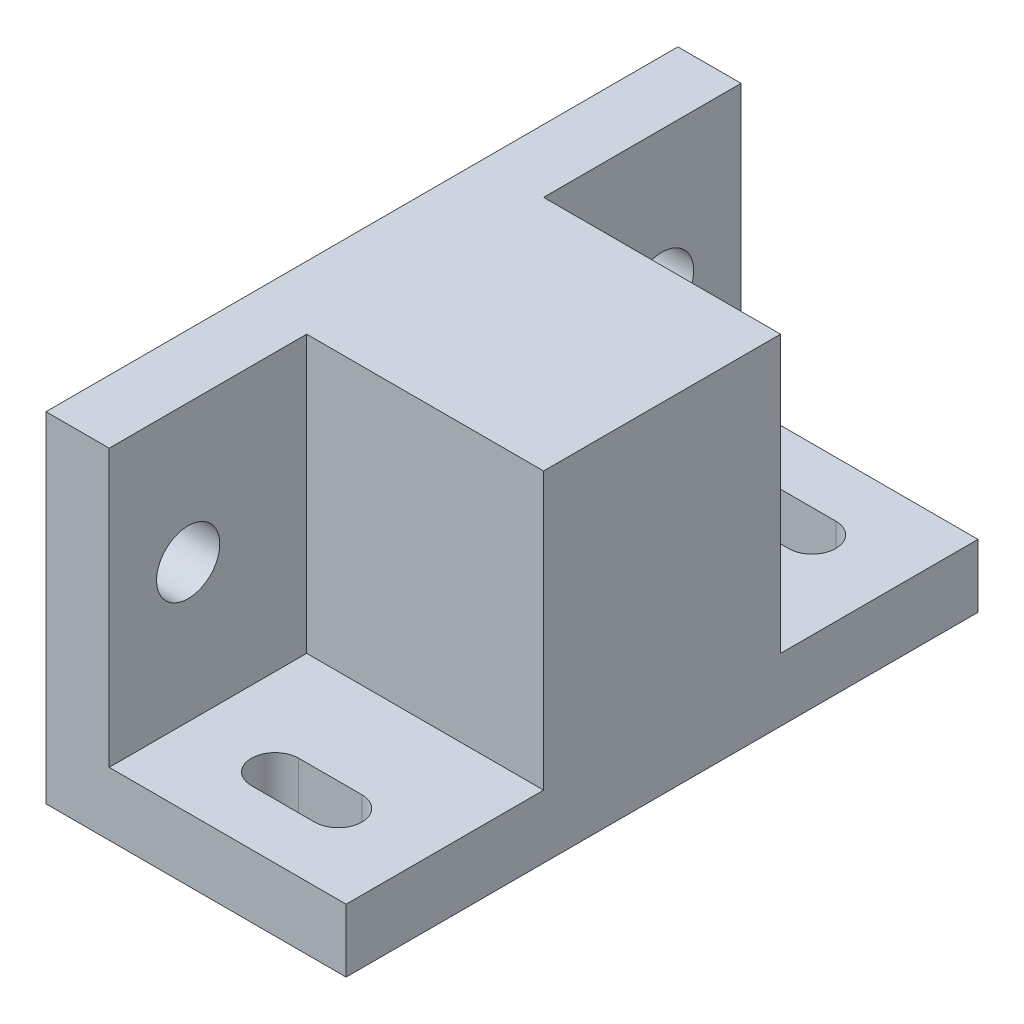
ISO-10303-21;
HEADER;
FILE_DESCRIPTION(('STEP AP214'),'2;1');
FILE_NAME('part.step','',(''),(''),'','','');
FILE_SCHEMA(('AUTOMOTIVE_DESIGN { 1 0 10303 214 1 1 1 1 }'));
ENDSEC;
DATA;
#1=APPLICATION_CONTEXT('core data for automotive mechanical design processes');
#2=APPLICATION_PROTOCOL_DEFINITION('international standard','automotive_design',2000,#1);
#3=PRODUCT_CONTEXT('',#1,'mechanical');
#4=PRODUCT('Part','Part','',(#3));
#5=PRODUCT_RELATED_PRODUCT_CATEGORY('part','',(#4));
#6=PRODUCT_DEFINITION_FORMATION('','',#4);
#7=PRODUCT_DEFINITION_CONTEXT('part definition',#1,'design');
#8=PRODUCT_DEFINITION('design','',#6,#7);
#9=PRODUCT_DEFINITION_SHAPE('','',#8);
#10=(LENGTH_UNIT() NAMED_UNIT(*) SI_UNIT(.MILLI.,.METRE.));
#11=(NAMED_UNIT(*) PLANE_ANGLE_UNIT() SI_UNIT($,.RADIAN.));
#12=(NAMED_UNIT(*) SI_UNIT($,.STERADIAN.) SOLID_ANGLE_UNIT());
#13=UNCERTAINTY_MEASURE_WITH_UNIT(LENGTH_MEASURE(1.E-05),#10,'distance_accuracy_value','');
#14=(GEOMETRIC_REPRESENTATION_CONTEXT(3) GLOBAL_UNCERTAINTY_ASSIGNED_CONTEXT((#13)) GLOBAL_UNIT_ASSIGNED_CONTEXT((#10,
#11,#12)) REPRESENTATION_CONTEXT('',''));
#15=CARTESIAN_POINT('',(0.,0.,0.));
#16=DIRECTION('',(0.,0.,1.));
#17=DIRECTION('',(1.,0.,0.));
#18=AXIS2_PLACEMENT_3D('',#15,#16,#17);
#19=CARTESIAN_POINT('',(0.,17.5,40.));
#20=DIRECTION('',(-1.,0.,0.));
#21=DIRECTION('',(0.,0.,1.));
#22=AXIS2_PLACEMENT_3D('',#19,#20,#21);
#23=PLANE('',#22);
#24=CARTESIAN_POINT('',(0.,8.75,5.));
#25=DIRECTION('',(1.,0.,0.));
#26=DIRECTION('',(0.,0.,1.));
#27=AXIS2_PLACEMENT_3D('',#24,#25,#26);
#28=CIRCLE('',#27,2.);
#29=CARTESIAN_POINT('',(0.,8.75,7.));
#30=VERTEX_POINT('',#29);
#31=EDGE_CURVE('E225',#30,#30,#28,.T.);
#32=ORIENTED_EDGE('',*,*,#31,.F.);
#33=EDGE_LOOP('',(#32));
#34=FACE_BOUND('',#33,.T.);
#35=DIRECTION('',(0.,-1.,0.));
#36=VECTOR('',#35,1.);
#37=CARTESIAN_POINT('',(0.,38.7132034355964,12.5));
#38=LINE('',#37,#36);
#39=CARTESIAN_POINT('',(0.,17.5,12.5));
#40=VERTEX_POINT('',#39);
#41=CARTESIAN_POINT('',(0.,0.,12.5));
#42=VERTEX_POINT('',#41);
#43=EDGE_CURVE('E195',#40,#42,#38,.T.);
#44=ORIENTED_EDGE('',*,*,#43,.T.);
#45=DIRECTION('',(0.,0.,-1.));
#46=VECTOR('',#45,1.);
#47=CARTESIAN_POINT('',(0.,0.,40.));
#48=LINE('',#47,#46);
#49=CARTESIAN_POINT('',(0.,0.,0.));
#50=VERTEX_POINT('',#49);
#51=EDGE_CURVE('E336',#42,#50,#48,.T.);
#52=ORIENTED_EDGE('',*,*,#51,.T.);
#53=DIRECTION('',(0.,1.,0.));
#54=VECTOR('',#53,1.);
#55=CARTESIAN_POINT('',(0.,17.5,0.));
#56=LINE('',#55,#54);
#57=CARTESIAN_POINT('',(0.,17.5,0.));
#58=VERTEX_POINT('',#57);
#59=EDGE_CURVE('E265',#50,#58,#56,.T.);
#60=ORIENTED_EDGE('',*,*,#59,.T.);
#61=DIRECTION('',(0.,0.,-1.));
#62=VECTOR('',#61,1.);
#63=CARTESIAN_POINT('',(0.,17.5,40.));
#64=LINE('',#63,#62);
#65=EDGE_CURVE('E47',#40,#58,#64,.T.);
#66=ORIENTED_EDGE('',*,*,#65,.F.);
#67=EDGE_LOOP('',(#44,#52,#60,#66));
#68=FACE_BOUND('',#67,.T.);
#69=ADVANCED_FACE('F39',(#34,#68),#23,.F.);
#70=CARTESIAN_POINT('',(0.,8.75,35.));
#71=DIRECTION('',(1.,0.,0.));
#72=DIRECTION('',(0.,0.,-1.));
#73=AXIS2_PLACEMENT_3D('',#70,#71,#72);
#74=CIRCLE('',#73,2.);
#75=CARTESIAN_POINT('',(0.,8.75,33.));
#76=VERTEX_POINT('',#75);
#77=EDGE_CURVE('E217',#76,#76,#74,.T.);
#78=ORIENTED_EDGE('',*,*,#77,.F.);
#79=EDGE_LOOP('',(#78));
#80=FACE_BOUND('',#79,.T.);
#81=DIRECTION('',(0.,-1.,0.));
#82=VECTOR('',#81,1.);
#83=CARTESIAN_POINT('',(0.,38.7132034355964,27.5));
#84=LINE('',#83,#82);
#85=CARTESIAN_POINT('',(0.,17.5,27.5));
#86=VERTEX_POINT('',#85);
#87=CARTESIAN_POINT('',(0.,0.,27.5));
#88=VERTEX_POINT('',#87);
#89=EDGE_CURVE('E61',#86,#88,#84,.T.);
#90=ORIENTED_EDGE('',*,*,#89,.F.);
#91=CARTESIAN_POINT('',(0.,17.5,40.));
#92=VERTEX_POINT('',#91);
#93=EDGE_CURVE('E11',#92,#86,#64,.T.);
#94=ORIENTED_EDGE('',*,*,#93,.F.);
#95=DIRECTION('',(0.,1.,0.));
#96=VECTOR('',#95,1.);
#97=CARTESIAN_POINT('',(0.,17.5,40.));
#98=LINE('',#97,#96);
#99=CARTESIAN_POINT('',(0.,0.,40.));
#100=VERTEX_POINT('',#99);
#101=EDGE_CURVE('E317',#100,#92,#98,.T.);
#102=ORIENTED_EDGE('',*,*,#101,.F.);
#103=EDGE_CURVE('E354',#100,#88,#48,.T.);
#104=ORIENTED_EDGE('',*,*,#103,.T.);
#105=EDGE_LOOP('',(#90,#94,#102,#104));
#106=FACE_BOUND('',#105,.T.);
#107=ADVANCED_FACE('F398',(#80,#106),#23,.F.);
#108=CARTESIAN_POINT('',(0.,0.,40.));
#109=DIRECTION('',(0.,-1.,0.));
#110=DIRECTION('',(0.,0.,-1.));
#111=AXIS2_PLACEMENT_3D('',#108,#109,#110);
#112=PLANE('',#111);
#113=DIRECTION('',(-1.,0.,0.));
#114=VECTOR('',#113,1.);
#115=CARTESIAN_POINT('',(9.5,0.,3.5));
#116=LINE('',#115,#114);
#117=CARTESIAN_POINT('',(9.5,0.,3.5));
#118=VERTEX_POINT('',#117);
#119=CARTESIAN_POINT('',(5.5,0.,3.5));
#120=VERTEX_POINT('',#119);
#121=EDGE_CURVE('E295',#118,#120,#116,.T.);
#122=ORIENTED_EDGE('',*,*,#121,.F.);
#123=CARTESIAN_POINT('',(9.5,0.,5.));
#124=DIRECTION('',(0.,1.,0.));
#125=DIRECTION('',(0.,0.,-1.));
#126=AXIS2_PLACEMENT_3D('',#123,#124,#125);
#127=CIRCLE('',#126,1.5);
#128=CARTESIAN_POINT('',(9.5,0.,6.5));
#129=VERTEX_POINT('',#128);
#130=EDGE_CURVE('E216',#129,#118,#127,.T.);
#131=ORIENTED_EDGE('',*,*,#130,.F.);
#132=DIRECTION('',(1.,0.,0.));
#133=VECTOR('',#132,1.);
#134=CARTESIAN_POINT('',(9.5,0.,6.5));
#135=LINE('',#134,#133);
#136=CARTESIAN_POINT('',(5.5,0.,6.5));
#137=VERTEX_POINT('',#136);
#138=EDGE_CURVE('E280',#137,#129,#135,.T.);
#139=ORIENTED_EDGE('',*,*,#138,.F.);
#140=CARTESIAN_POINT('',(5.5,0.,5.));
#141=DIRECTION('',(0.,1.,0.));
#142=DIRECTION('',(0.,0.,-1.));
#143=AXIS2_PLACEMENT_3D('',#140,#141,#142);
#144=CIRCLE('',#143,1.5);
#145=EDGE_CURVE('E299',#120,#137,#144,.T.);
#146=ORIENTED_EDGE('',*,*,#145,.F.);
#147=EDGE_LOOP('',(#122,#131,#139,#146));
#148=FACE_BOUND('',#147,.T.);
#149=DIRECTION('',(-1.,0.,0.));
#150=VECTOR('',#149,1.);
#151=CARTESIAN_POINT('',(0.,0.,12.5));
#152=LINE('',#151,#150);
#153=CARTESIAN_POINT('',(15.,0.,12.5));
#154=VERTEX_POINT('',#153);
#155=EDGE_CURVE('E191',#154,#42,#152,.T.);
#156=ORIENTED_EDGE('',*,*,#155,.F.);
#157=DIRECTION('',(0.,0.,-1.));
#158=VECTOR('',#157,1.);
#159=CARTESIAN_POINT('',(15.,0.,40.));
#160=LINE('',#159,#158);
#161=CARTESIAN_POINT('',(15.,0.,0.));
#162=VERTEX_POINT('',#161);
#163=EDGE_CURVE('E175',#154,#162,#160,.T.);
#164=ORIENTED_EDGE('',*,*,#163,.T.);
#165=DIRECTION('',(-1.,0.,0.));
#166=VECTOR('',#165,1.);
#167=CARTESIAN_POINT('',(0.,0.,0.));
#168=LINE('',#167,#166);
#169=EDGE_CURVE('E322',#162,#50,#168,.T.);
#170=ORIENTED_EDGE('',*,*,#169,.T.);
#171=ORIENTED_EDGE('',*,*,#51,.F.);
#172=EDGE_LOOP('',(#156,#164,#170,#171));
#173=FACE_BOUND('',#172,.T.);
#174=ADVANCED_FACE('F383',(#148,#173),#112,.F.);
#175=DIRECTION('',(-1.,0.,0.));
#176=VECTOR('',#175,1.);
#177=CARTESIAN_POINT('',(9.5,0.,33.5));
#178=LINE('',#177,#176);
#179=CARTESIAN_POINT('',(9.5,0.,33.5));
#180=VERTEX_POINT('',#179);
#181=CARTESIAN_POINT('',(5.5,0.,33.5));
#182=VERTEX_POINT('',#181);
#183=EDGE_CURVE('E250',#180,#182,#178,.T.);
#184=ORIENTED_EDGE('',*,*,#183,.F.);
#185=CARTESIAN_POINT('',(9.5,0.,35.));
#186=DIRECTION('',(0.,1.,0.));
#187=DIRECTION('',(0.,0.,1.));
#188=AXIS2_PLACEMENT_3D('',#185,#186,#187);
#189=CIRCLE('',#188,1.5);
#190=CARTESIAN_POINT('',(9.5,0.,36.5));
#191=VERTEX_POINT('',#190);
#192=EDGE_CURVE('E247',#191,#180,#189,.T.);
#193=ORIENTED_EDGE('',*,*,#192,.F.);
#194=DIRECTION('',(1.,0.,0.));
#195=VECTOR('',#194,1.);
#196=CARTESIAN_POINT('',(9.5,0.,36.5));
#197=LINE('',#196,#195);
#198=CARTESIAN_POINT('',(5.5,0.,36.5));
#199=VERTEX_POINT('',#198);
#200=EDGE_CURVE('E234',#199,#191,#197,.T.);
#201=ORIENTED_EDGE('',*,*,#200,.F.);
#202=CARTESIAN_POINT('',(5.5,0.,35.));
#203=DIRECTION('',(0.,1.,0.));
#204=DIRECTION('',(0.,0.,1.));
#205=AXIS2_PLACEMENT_3D('',#202,#203,#204);
#206=CIRCLE('',#205,1.5);
#207=EDGE_CURVE('E255',#182,#199,#206,.T.);
#208=ORIENTED_EDGE('',*,*,#207,.F.);
#209=EDGE_LOOP('',(#184,#193,#201,#208));
#210=FACE_BOUND('',#209,.T.);
#211=DIRECTION('',(1.,0.,0.));
#212=VECTOR('',#211,1.);
#213=CARTESIAN_POINT('',(0.,0.,27.5));
#214=LINE('',#213,#212);
#215=CARTESIAN_POINT('',(15.,0.,27.5));
#216=VERTEX_POINT('',#215);
#217=EDGE_CURVE('E169',#88,#216,#214,.T.);
#218=ORIENTED_EDGE('',*,*,#217,.F.);
#219=ORIENTED_EDGE('',*,*,#103,.F.);
#220=DIRECTION('',(-1.,0.,0.));
#221=VECTOR('',#220,1.);
#222=CARTESIAN_POINT('',(0.,0.,40.));
#223=LINE('',#222,#221);
#224=CARTESIAN_POINT('',(15.,0.,40.));
#225=VERTEX_POINT('',#224);
#226=EDGE_CURVE('E170',#225,#100,#223,.T.);
#227=ORIENTED_EDGE('',*,*,#226,.F.);
#228=EDGE_CURVE('E164',#225,#216,#160,.T.);
#229=ORIENTED_EDGE('',*,*,#228,.T.);
#230=EDGE_LOOP('',(#218,#219,#227,#229));
#231=FACE_BOUND('',#230,.T.);
#232=ADVANCED_FACE('F166',(#210,#231),#112,.F.);
#233=CARTESIAN_POINT('',(-4.,17.5,40.));
#234=DIRECTION('',(0.,-1.,0.));
#235=DIRECTION('',(0.,0.,-1.));
#236=AXIS2_PLACEMENT_3D('',#233,#234,#235);
#237=PLANE('',#236);
#238=DIRECTION('',(-1.,0.,0.));
#239=VECTOR('',#238,1.);
#240=CARTESIAN_POINT('',(-4.,17.5,0.));
#241=LINE('',#240,#239);
#242=CARTESIAN_POINT('',(-4.,17.5,0.));
#243=VERTEX_POINT('',#242);
#244=EDGE_CURVE('E339',#58,#243,#241,.T.);
#245=ORIENTED_EDGE('',*,*,#244,.T.);
#246=DIRECTION('',(0.,0.,-1.));
#247=VECTOR('',#246,1.);
#248=CARTESIAN_POINT('',(-4.,17.5,40.));
#249=LINE('',#248,#247);
#250=CARTESIAN_POINT('',(-4.,17.5,40.));
#251=VERTEX_POINT('',#250);
#252=EDGE_CURVE('E363',#251,#243,#249,.T.);
#253=ORIENTED_EDGE('',*,*,#252,.F.);
#254=DIRECTION('',(-1.,0.,0.));
#255=VECTOR('',#254,1.);
#256=CARTESIAN_POINT('',(-4.,17.5,40.));
#257=LINE('',#256,#255);
#258=EDGE_CURVE('E321',#92,#251,#257,.T.);
#259=ORIENTED_EDGE('',*,*,#258,.F.);
#260=ORIENTED_EDGE('',*,*,#93,.T.);
#261=DIRECTION('',(-1.,0.,0.));
#262=VECTOR('',#261,1.);
#263=CARTESIAN_POINT('',(0.,17.5,27.5));
#264=LINE('',#263,#262);
#265=CARTESIAN_POINT('',(15.,17.5,27.5));
#266=VERTEX_POINT('',#265);
#267=EDGE_CURVE('E198',#266,#86,#264,.T.);
#268=ORIENTED_EDGE('',*,*,#267,.F.);
#269=DIRECTION('',(0.,0.,1.));
#270=VECTOR('',#269,1.);
#271=CARTESIAN_POINT('',(15.,17.5,27.5));
#272=LINE('',#271,#270);
#273=CARTESIAN_POINT('',(15.,17.5,12.5));
#274=VERTEX_POINT('',#273);
#275=EDGE_CURVE('E183',#274,#266,#272,.T.);
#276=ORIENTED_EDGE('',*,*,#275,.F.);
#277=DIRECTION('',(1.,0.,0.));
#278=VECTOR('',#277,1.);
#279=CARTESIAN_POINT('',(0.,17.5,12.5));
#280=LINE('',#279,#278);
#281=EDGE_CURVE('E208',#40,#274,#280,.T.);
#282=ORIENTED_EDGE('',*,*,#281,.F.);
#283=ORIENTED_EDGE('',*,*,#65,.T.);
#284=EDGE_LOOP('',(#245,#253,#259,#260,#268,#276,#282,#283));
#285=FACE_BOUND('',#284,.T.);
#286=ADVANCED_FACE('F373',(#285),#237,.F.);
#287=CARTESIAN_POINT('',(-4.,-4.,40.));
#288=DIRECTION('',(1.,0.,0.));
#289=DIRECTION('',(0.,0.,-1.));
#290=AXIS2_PLACEMENT_3D('',#287,#288,#289);
#291=PLANE('',#290);
#292=CARTESIAN_POINT('',(-4.,8.75,35.));
#293=DIRECTION('',(1.,0.,0.));
#294=DIRECTION('',(0.,0.,-1.));
#295=AXIS2_PLACEMENT_3D('',#292,#293,#294);
#296=CIRCLE('',#295,2.);
#297=CARTESIAN_POINT('',(-4.,8.75,33.));
#298=VERTEX_POINT('',#297);
#299=EDGE_CURVE('E212',#298,#298,#296,.T.);
#300=ORIENTED_EDGE('',*,*,#299,.T.);
#301=EDGE_LOOP('',(#300));
#302=FACE_BOUND('',#301,.T.);
#303=CARTESIAN_POINT('',(-4.,8.75,5.));
#304=DIRECTION('',(1.,0.,0.));
#305=DIRECTION('',(0.,0.,1.));
#306=AXIS2_PLACEMENT_3D('',#303,#304,#305);
#307=CIRCLE('',#306,2.);
#308=CARTESIAN_POINT('',(-4.,8.75,7.));
#309=VERTEX_POINT('',#308);
#310=EDGE_CURVE('E221',#309,#309,#307,.T.);
#311=ORIENTED_EDGE('',*,*,#310,.T.);
#312=EDGE_LOOP('',(#311));
#313=FACE_BOUND('',#312,.T.);
#314=DIRECTION('',(0.,-1.,0.));
#315=VECTOR('',#314,1.);
#316=CARTESIAN_POINT('',(-4.,-4.,0.));
#317=LINE('',#316,#315);
#318=CARTESIAN_POINT('',(-4.,-4.,0.));
#319=VERTEX_POINT('',#318);
#320=EDGE_CURVE('E342',#243,#319,#317,.T.);
#321=ORIENTED_EDGE('',*,*,#320,.T.);
#322=DIRECTION('',(0.,0.,-1.));
#323=VECTOR('',#322,1.);
#324=CARTESIAN_POINT('',(-4.,-4.,40.));
#325=LINE('',#324,#323);
#326=CARTESIAN_POINT('',(-4.,-4.,40.));
#327=VERTEX_POINT('',#326);
#328=EDGE_CURVE('E360',#327,#319,#325,.T.);
#329=ORIENTED_EDGE('',*,*,#328,.F.);
#330=DIRECTION('',(0.,-1.,0.));
#331=VECTOR('',#330,1.);
#332=CARTESIAN_POINT('',(-4.,-4.,40.));
#333=LINE('',#332,#331);
#334=EDGE_CURVE('E325',#251,#327,#333,.T.);
#335=ORIENTED_EDGE('',*,*,#334,.F.);
#336=ORIENTED_EDGE('',*,*,#252,.T.);
#337=EDGE_LOOP('',(#321,#329,#335,#336));
#338=FACE_BOUND('',#337,.T.);
#339=ADVANCED_FACE('F391',(#302,#313,#338),#291,.F.);
#340=CARTESIAN_POINT('',(15.,-4.00000000000001,40.));
#341=DIRECTION('',(0.,1.,0.));
#342=DIRECTION('',(-1.,0.,0.));
#343=AXIS2_PLACEMENT_3D('',#340,#341,#342);
#344=PLANE('',#343);
#345=DIRECTION('',(1.,0.,0.));
#346=VECTOR('',#345,1.);
#347=CARTESIAN_POINT('',(9.5,-4.00000000000001,36.5));
#348=LINE('',#347,#346);
#349=CARTESIAN_POINT('',(5.5,-4.00000000000001,36.5));
#350=VERTEX_POINT('',#349);
#351=CARTESIAN_POINT('',(9.5,-4.00000000000001,36.5));
#352=VERTEX_POINT('',#351);
#353=EDGE_CURVE('E242',#350,#352,#348,.T.);
#354=ORIENTED_EDGE('',*,*,#353,.T.);
#355=CARTESIAN_POINT('',(9.5,-4.00000000000001,35.));
#356=DIRECTION('',(0.,1.,0.));
#357=DIRECTION('',(0.,0.,1.));
#358=AXIS2_PLACEMENT_3D('',#355,#356,#357);
#359=CIRCLE('',#358,1.5);
#360=CARTESIAN_POINT('',(9.5,-4.00000000000001,33.5));
#361=VERTEX_POINT('',#360);
#362=EDGE_CURVE('E229',#352,#361,#359,.T.);
#363=ORIENTED_EDGE('',*,*,#362,.T.);
#364=DIRECTION('',(-1.,0.,0.));
#365=VECTOR('',#364,1.);
#366=CARTESIAN_POINT('',(9.5,-4.00000000000001,33.5));
#367=LINE('',#366,#365);
#368=CARTESIAN_POINT('',(5.5,-4.,33.5));
#369=VERTEX_POINT('',#368);
#370=EDGE_CURVE('E233',#361,#369,#367,.T.);
#371=ORIENTED_EDGE('',*,*,#370,.T.);
#372=CARTESIAN_POINT('',(5.5,-4.00000000000001,35.));
#373=DIRECTION('',(0.,1.,0.));
#374=DIRECTION('',(0.,0.,1.));
#375=AXIS2_PLACEMENT_3D('',#372,#373,#374);
#376=CIRCLE('',#375,1.5);
#377=EDGE_CURVE('E238',#369,#350,#376,.T.);
#378=ORIENTED_EDGE('',*,*,#377,.T.);
#379=EDGE_LOOP('',(#354,#363,#371,#378));
#380=FACE_BOUND('',#379,.T.);
#381=DIRECTION('',(1.,0.,0.));
#382=VECTOR('',#381,1.);
#383=CARTESIAN_POINT('',(9.5,-4.00000000000001,6.5));
#384=LINE('',#383,#382);
#385=CARTESIAN_POINT('',(5.5,-4.00000000000001,6.5));
#386=VERTEX_POINT('',#385);
#387=CARTESIAN_POINT('',(9.5,-4.00000000000001,6.5));
#388=VERTEX_POINT('',#387);
#389=EDGE_CURVE('E288',#386,#388,#384,.T.);
#390=ORIENTED_EDGE('',*,*,#389,.T.);
#391=CARTESIAN_POINT('',(9.5,-4.00000000000001,5.));
#392=DIRECTION('',(0.,1.,0.));
#393=DIRECTION('',(0.,0.,-1.));
#394=AXIS2_PLACEMENT_3D('',#391,#392,#393);
#395=CIRCLE('',#394,1.5);
#396=CARTESIAN_POINT('',(9.5,-4.00000000000001,3.5));
#397=VERTEX_POINT('',#396);
#398=EDGE_CURVE('E275',#388,#397,#395,.T.);
#399=ORIENTED_EDGE('',*,*,#398,.T.);
#400=DIRECTION('',(-1.,0.,0.));
#401=VECTOR('',#400,1.);
#402=CARTESIAN_POINT('',(9.5,-4.00000000000001,3.5));
#403=LINE('',#402,#401);
#404=CARTESIAN_POINT('',(5.5,-4.,3.5));
#405=VERTEX_POINT('',#404);
#406=EDGE_CURVE('E279',#397,#405,#403,.T.);
#407=ORIENTED_EDGE('',*,*,#406,.T.);
#408=CARTESIAN_POINT('',(5.5,-4.00000000000001,5.));
#409=DIRECTION('',(0.,1.,0.));
#410=DIRECTION('',(0.,0.,-1.));
#411=AXIS2_PLACEMENT_3D('',#408,#409,#410);
#412=CIRCLE('',#411,1.5);
#413=EDGE_CURVE('E284',#405,#386,#412,.T.);
#414=ORIENTED_EDGE('',*,*,#413,.T.);
#415=EDGE_LOOP('',(#390,#399,#407,#414));
#416=FACE_BOUND('',#415,.T.);
#417=DIRECTION('',(1.,0.,0.));
#418=VECTOR('',#417,1.);
#419=CARTESIAN_POINT('',(15.,-4.00000000000001,0.));
#420=LINE('',#419,#418);
#421=CARTESIAN_POINT('',(15.,-4.00000000000001,0.));
#422=VERTEX_POINT('',#421);
#423=EDGE_CURVE('E345',#319,#422,#420,.T.);
#424=ORIENTED_EDGE('',*,*,#423,.T.);
#425=DIRECTION('',(0.,0.,-1.));
#426=VECTOR('',#425,1.);
#427=CARTESIAN_POINT('',(15.,-4.00000000000001,40.));
#428=LINE('',#427,#426);
#429=CARTESIAN_POINT('',(15.,-4.00000000000001,40.));
#430=VERTEX_POINT('',#429);
#431=EDGE_CURVE('E174',#430,#422,#428,.T.);
#432=ORIENTED_EDGE('',*,*,#431,.F.);
#433=DIRECTION('',(1.,0.,0.));
#434=VECTOR('',#433,1.);
#435=CARTESIAN_POINT('',(15.,-4.00000000000001,40.));
#436=LINE('',#435,#434);
#437=EDGE_CURVE('E328',#327,#430,#436,.T.);
#438=ORIENTED_EDGE('',*,*,#437,.F.);
#439=ORIENTED_EDGE('',*,*,#328,.T.);
#440=EDGE_LOOP('',(#424,#432,#438,#439));
#441=FACE_BOUND('',#440,.T.);
#442=ADVANCED_FACE('F389',(#380,#416,#441),#344,.F.);
#443=CARTESIAN_POINT('',(15.,0.,40.));
#444=DIRECTION('',(-1.,0.,0.));
#445=DIRECTION('',(0.,0.,1.));
#446=AXIS2_PLACEMENT_3D('',#443,#444,#445);
#447=PLANE('',#446);
#448=DIRECTION('',(0.,1.,0.));
#449=VECTOR('',#448,1.);
#450=CARTESIAN_POINT('',(15.,0.,0.));
#451=LINE('',#450,#449);
#452=EDGE_CURVE('E348',#422,#162,#451,.T.);
#453=ORIENTED_EDGE('',*,*,#452,.T.);
#454=ORIENTED_EDGE('',*,*,#163,.F.);
#455=DIRECTION('',(0.,-1.,0.));
#456=VECTOR('',#455,1.);
#457=CARTESIAN_POINT('',(15.,38.7132034355964,12.5));
#458=LINE('',#457,#456);
#459=EDGE_CURVE('E187',#274,#154,#458,.T.);
#460=ORIENTED_EDGE('',*,*,#459,.F.);
#461=ORIENTED_EDGE('',*,*,#275,.T.);
#462=DIRECTION('',(0.,-1.,0.));
#463=VECTOR('',#462,1.);
#464=CARTESIAN_POINT('',(15.,38.7132034355964,27.5));
#465=LINE('',#464,#463);
#466=EDGE_CURVE('E179',#266,#216,#465,.T.);
#467=ORIENTED_EDGE('',*,*,#466,.T.);
#468=ORIENTED_EDGE('',*,*,#228,.F.);
#469=DIRECTION('',(0.,1.,0.));
#470=VECTOR('',#469,1.);
#471=CARTESIAN_POINT('',(15.,0.,40.));
#472=LINE('',#471,#470);
#473=EDGE_CURVE('E331',#430,#225,#472,.T.);
#474=ORIENTED_EDGE('',*,*,#473,.F.);
#475=ORIENTED_EDGE('',*,*,#431,.T.);
#476=EDGE_LOOP('',(#453,#454,#460,#461,#467,#468,#474,#475));
#477=FACE_BOUND('',#476,.T.);
#478=ADVANCED_FACE('F181',(#477),#447,.F.);
#479=CARTESIAN_POINT('',(0.,0.,40.));
#480=DIRECTION('',(0.,0.,1.));
#481=DIRECTION('',(1.,0.,0.));
#482=AXIS2_PLACEMENT_3D('',#479,#480,#481);
#483=PLANE('',#482);
#484=ORIENTED_EDGE('',*,*,#101,.T.);
#485=ORIENTED_EDGE('',*,*,#258,.T.);
#486=ORIENTED_EDGE('',*,*,#334,.T.);
#487=ORIENTED_EDGE('',*,*,#437,.T.);
#488=ORIENTED_EDGE('',*,*,#473,.T.);
#489=ORIENTED_EDGE('',*,*,#226,.T.);
#490=EDGE_LOOP('',(#484,#485,#486,#487,#488,#489));
#491=FACE_BOUND('',#490,.T.);
#492=ADVANCED_FACE('F393',(#491),#483,.T.);
#493=CARTESIAN_POINT('',(0.,0.,0.));
#494=DIRECTION('',(0.,0.,1.));
#495=DIRECTION('',(1.,0.,0.));
#496=AXIS2_PLACEMENT_3D('',#493,#494,#495);
#497=PLANE('',#496);
#498=ORIENTED_EDGE('',*,*,#59,.F.);
#499=ORIENTED_EDGE('',*,*,#169,.F.);
#500=ORIENTED_EDGE('',*,*,#452,.F.);
#501=ORIENTED_EDGE('',*,*,#423,.F.);
#502=ORIENTED_EDGE('',*,*,#320,.F.);
#503=ORIENTED_EDGE('',*,*,#244,.F.);
#504=EDGE_LOOP('',(#498,#499,#500,#501,#502,#503));
#505=FACE_BOUND('',#504,.T.);
#506=ADVANCED_FACE('F377',(#505),#497,.F.);
#507=CARTESIAN_POINT('',(9.5,-4.00000000000001,5.));
#508=DIRECTION('',(0.,1.,0.));
#509=DIRECTION('',(0.,0.,1.));
#510=AXIS2_PLACEMENT_3D('',#507,#508,#509);
#511=CYLINDRICAL_SURFACE('',#510,1.5);
#512=ORIENTED_EDGE('',*,*,#130,.T.);
#513=DIRECTION('',(0.,1.,0.));
#514=VECTOR('',#513,1.);
#515=CARTESIAN_POINT('',(9.5,-4.00000000000001,3.5));
#516=LINE('',#515,#514);
#517=EDGE_CURVE('E292',#397,#118,#516,.T.);
#518=ORIENTED_EDGE('',*,*,#517,.F.);
#519=ORIENTED_EDGE('',*,*,#398,.F.);
#520=DIRECTION('',(0.,1.,0.));
#521=VECTOR('',#520,1.);
#522=CARTESIAN_POINT('',(9.5,-4.00000000000001,6.5));
#523=LINE('',#522,#521);
#524=EDGE_CURVE('E251',#388,#129,#523,.T.);
#525=ORIENTED_EDGE('',*,*,#524,.T.);
#526=EDGE_LOOP('',(#512,#518,#519,#525));
#527=FACE_BOUND('',#526,.T.);
#528=ADVANCED_FACE('F448',(#527),#511,.F.);
#529=CARTESIAN_POINT('',(9.5,-4.00000000000001,6.5));
#530=DIRECTION('',(0.,0.,1.));
#531=DIRECTION('',(1.,0.,0.));
#532=AXIS2_PLACEMENT_3D('',#529,#530,#531);
#533=PLANE('',#532);
#534=ORIENTED_EDGE('',*,*,#138,.T.);
#535=ORIENTED_EDGE('',*,*,#524,.F.);
#536=ORIENTED_EDGE('',*,*,#389,.F.);
#537=DIRECTION('',(0.,1.,0.));
#538=VECTOR('',#537,1.);
#539=CARTESIAN_POINT('',(5.5,-4.00000000000001,6.5));
#540=LINE('',#539,#538);
#541=EDGE_CURVE('E308',#386,#137,#540,.T.);
#542=ORIENTED_EDGE('',*,*,#541,.T.);
#543=EDGE_LOOP('',(#534,#535,#536,#542));
#544=FACE_BOUND('',#543,.T.);
#545=ADVANCED_FACE('F444',(#544),#533,.F.);
#546=CARTESIAN_POINT('',(5.5,-4.00000000000001,5.));
#547=DIRECTION('',(0.,1.,0.));
#548=DIRECTION('',(0.,0.,1.));
#549=AXIS2_PLACEMENT_3D('',#546,#547,#548);
#550=CYLINDRICAL_SURFACE('',#549,1.5);
#551=ORIENTED_EDGE('',*,*,#145,.T.);
#552=ORIENTED_EDGE('',*,*,#541,.F.);
#553=ORIENTED_EDGE('',*,*,#413,.F.);
#554=DIRECTION('',(0.,1.,0.));
#555=VECTOR('',#554,1.);
#556=CARTESIAN_POINT('',(5.5,-4.00000000000001,3.5));
#557=LINE('',#556,#555);
#558=EDGE_CURVE('E311',#405,#120,#557,.T.);
#559=ORIENTED_EDGE('',*,*,#558,.T.);
#560=EDGE_LOOP('',(#551,#552,#553,#559));
#561=FACE_BOUND('',#560,.T.);
#562=ADVANCED_FACE('F447',(#561),#550,.F.);
#563=CARTESIAN_POINT('',(9.5,-4.00000000000001,3.5));
#564=DIRECTION('',(0.,0.,-1.));
#565=DIRECTION('',(-1.,0.,0.));
#566=AXIS2_PLACEMENT_3D('',#563,#564,#565);
#567=PLANE('',#566);
#568=ORIENTED_EDGE('',*,*,#121,.T.);
#569=ORIENTED_EDGE('',*,*,#558,.F.);
#570=ORIENTED_EDGE('',*,*,#406,.F.);
#571=ORIENTED_EDGE('',*,*,#517,.T.);
#572=EDGE_LOOP('',(#568,#569,#570,#571));
#573=FACE_BOUND('',#572,.T.);
#574=ADVANCED_FACE('F442',(#573),#567,.F.);
#575=CARTESIAN_POINT('',(9.5,-4.00000000000001,35.));
#576=DIRECTION('',(0.,1.,0.));
#577=DIRECTION('',(0.,0.,1.));
#578=AXIS2_PLACEMENT_3D('',#575,#576,#577);
#579=CYLINDRICAL_SURFACE('',#578,1.5);
#580=ORIENTED_EDGE('',*,*,#192,.T.);
#581=DIRECTION('',(0.,1.,0.));
#582=VECTOR('',#581,1.);
#583=CARTESIAN_POINT('',(9.5,-4.00000000000001,33.5));
#584=LINE('',#583,#582);
#585=EDGE_CURVE('E246',#361,#180,#584,.T.);
#586=ORIENTED_EDGE('',*,*,#585,.F.);
#587=ORIENTED_EDGE('',*,*,#362,.F.);
#588=DIRECTION('',(0.,1.,0.));
#589=VECTOR('',#588,1.);
#590=CARTESIAN_POINT('',(9.5,-4.00000000000001,36.5));
#591=LINE('',#590,#589);
#592=EDGE_CURVE('E262',#352,#191,#591,.T.);
#593=ORIENTED_EDGE('',*,*,#592,.T.);
#594=EDGE_LOOP('',(#580,#586,#587,#593));
#595=FACE_BOUND('',#594,.T.);
#596=ADVANCED_FACE('F432',(#595),#579,.F.);
#597=CARTESIAN_POINT('',(9.5,-4.00000000000001,36.5));
#598=DIRECTION('',(0.,0.,1.));
#599=DIRECTION('',(1.,0.,0.));
#600=AXIS2_PLACEMENT_3D('',#597,#598,#599);
#601=PLANE('',#600);
#602=ORIENTED_EDGE('',*,*,#200,.T.);
#603=ORIENTED_EDGE('',*,*,#592,.F.);
#604=ORIENTED_EDGE('',*,*,#353,.F.);
#605=DIRECTION('',(0.,1.,0.));
#606=VECTOR('',#605,1.);
#607=CARTESIAN_POINT('',(5.5,-4.00000000000001,36.5));
#608=LINE('',#607,#606);
#609=EDGE_CURVE('E266',#350,#199,#608,.T.);
#610=ORIENTED_EDGE('',*,*,#609,.T.);
#611=EDGE_LOOP('',(#602,#603,#604,#610));
#612=FACE_BOUND('',#611,.T.);
#613=ADVANCED_FACE('F428',(#612),#601,.F.);
#614=CARTESIAN_POINT('',(5.5,-4.00000000000001,35.));
#615=DIRECTION('',(0.,1.,0.));
#616=DIRECTION('',(0.,0.,1.));
#617=AXIS2_PLACEMENT_3D('',#614,#615,#616);
#618=CYLINDRICAL_SURFACE('',#617,1.5);
#619=ORIENTED_EDGE('',*,*,#207,.T.);
#620=ORIENTED_EDGE('',*,*,#609,.F.);
#621=ORIENTED_EDGE('',*,*,#377,.F.);
#622=DIRECTION('',(0.,1.,0.));
#623=VECTOR('',#622,1.);
#624=CARTESIAN_POINT('',(5.5,-4.00000000000001,33.5));
#625=LINE('',#624,#623);
#626=EDGE_CURVE('E269',#369,#182,#625,.T.);
#627=ORIENTED_EDGE('',*,*,#626,.T.);
#628=EDGE_LOOP('',(#619,#620,#621,#627));
#629=FACE_BOUND('',#628,.T.);
#630=ADVANCED_FACE('F431',(#629),#618,.F.);
#631=CARTESIAN_POINT('',(9.5,-4.00000000000001,33.5));
#632=DIRECTION('',(0.,0.,-1.));
#633=DIRECTION('',(-1.,0.,0.));
#634=AXIS2_PLACEMENT_3D('',#631,#632,#633);
#635=PLANE('',#634);
#636=ORIENTED_EDGE('',*,*,#183,.T.);
#637=ORIENTED_EDGE('',*,*,#626,.F.);
#638=ORIENTED_EDGE('',*,*,#370,.F.);
#639=ORIENTED_EDGE('',*,*,#585,.T.);
#640=EDGE_LOOP('',(#636,#637,#638,#639));
#641=FACE_BOUND('',#640,.T.);
#642=ADVANCED_FACE('F422',(#641),#635,.F.);
#643=CARTESIAN_POINT('',(-4.,8.75,5.));
#644=DIRECTION('',(1.,0.,0.));
#645=DIRECTION('',(0.,0.,-1.));
#646=AXIS2_PLACEMENT_3D('',#643,#644,#645);
#647=CYLINDRICAL_SURFACE('',#646,2.);
#648=ORIENTED_EDGE('',*,*,#310,.F.);
#649=EDGE_LOOP('',(#648));
#650=FACE_BOUND('',#649,.T.);
#651=ORIENTED_EDGE('',*,*,#31,.T.);
#652=EDGE_LOOP('',(#651));
#653=FACE_BOUND('',#652,.T.);
#654=ADVANCED_FACE('F413',(#650,#653),#647,.F.);
#655=CARTESIAN_POINT('',(-4.,8.75,35.));
#656=DIRECTION('',(1.,0.,0.));
#657=DIRECTION('',(0.,0.,-1.));
#658=AXIS2_PLACEMENT_3D('',#655,#656,#657);
#659=CYLINDRICAL_SURFACE('',#658,2.);
#660=ORIENTED_EDGE('',*,*,#299,.F.);
#661=EDGE_LOOP('',(#660));
#662=FACE_BOUND('',#661,.T.);
#663=ORIENTED_EDGE('',*,*,#77,.T.);
#664=EDGE_LOOP('',(#663));
#665=FACE_BOUND('',#664,.T.);
#666=ADVANCED_FACE('F410',(#662,#665),#659,.F.);
#667=CARTESIAN_POINT('',(0.,38.7132034355964,12.5));
#668=DIRECTION('',(0.,0.,1.));
#669=DIRECTION('',(1.,0.,0.));
#670=AXIS2_PLACEMENT_3D('',#667,#668,#669);
#671=PLANE('',#670);
#672=ORIENTED_EDGE('',*,*,#43,.F.);
#673=ORIENTED_EDGE('',*,*,#281,.T.);
#674=ORIENTED_EDGE('',*,*,#459,.T.);
#675=ORIENTED_EDGE('',*,*,#155,.T.);
#676=EDGE_LOOP('',(#672,#673,#674,#675));
#677=FACE_BOUND('',#676,.T.);
#678=ADVANCED_FACE('F412',(#677),#671,.F.);
#679=CARTESIAN_POINT('',(0.,38.7132034355964,27.5));
#680=DIRECTION('',(0.,0.,-1.));
#681=DIRECTION('',(-1.,0.,0.));
#682=AXIS2_PLACEMENT_3D('',#679,#680,#681);
#683=PLANE('',#682);
#684=ORIENTED_EDGE('',*,*,#466,.F.);
#685=ORIENTED_EDGE('',*,*,#267,.T.);
#686=ORIENTED_EDGE('',*,*,#89,.T.);
#687=ORIENTED_EDGE('',*,*,#217,.T.);
#688=EDGE_LOOP('',(#684,#685,#686,#687));
#689=FACE_BOUND('',#688,.T.);
#690=ADVANCED_FACE('F189',(#689),#683,.F.);
#691=CLOSED_SHELL('',(#69,#107,#174,#232,#286,#339,#442,#478,#492,#506,#528,#545,#562,#574,#596,
#613,#630,#642,#654,#666,#678,#690));
#692=MANIFOLD_SOLID_BREP('B2',#691);
#693=ADVANCED_BREP_SHAPE_REPRESENTATION('',(#18,#692),#14);
#694=SHAPE_DEFINITION_REPRESENTATION(#9,#693);
ENDSEC;
END-ISO-10303-21;
